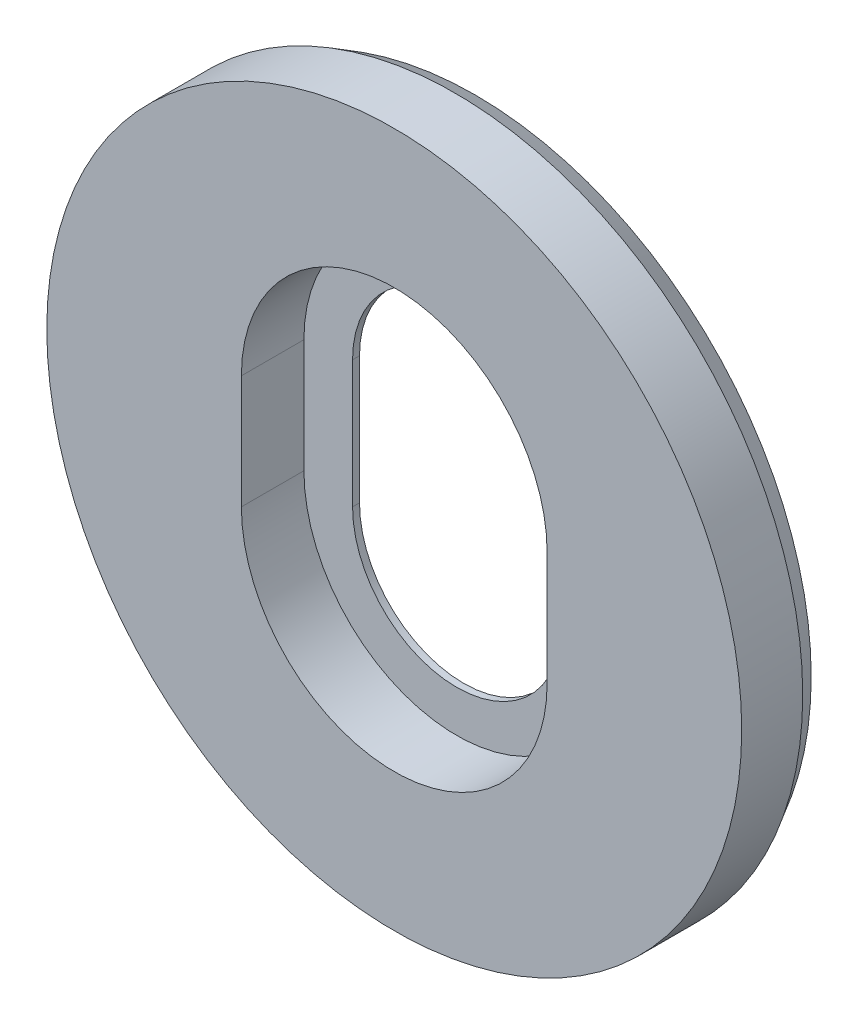
ISO-10303-21;
HEADER;
FILE_DESCRIPTION(('STEP AP214'),'2;1');
FILE_NAME('part.step','',(''),(''),'','','');
FILE_SCHEMA(('AUTOMOTIVE_DESIGN { 1 0 10303 214 1 1 1 1 }'));
ENDSEC;
DATA;
#1=APPLICATION_CONTEXT('core data for automotive mechanical design processes');
#2=APPLICATION_PROTOCOL_DEFINITION('international standard','automotive_design',2000,#1);
#3=PRODUCT_CONTEXT('',#1,'mechanical');
#4=PRODUCT('Part','Part','',(#3));
#5=PRODUCT_RELATED_PRODUCT_CATEGORY('part','',(#4));
#6=PRODUCT_DEFINITION_FORMATION('','',#4);
#7=PRODUCT_DEFINITION_CONTEXT('part definition',#1,'design');
#8=PRODUCT_DEFINITION('design','',#6,#7);
#9=PRODUCT_DEFINITION_SHAPE('','',#8);
#10=(LENGTH_UNIT() NAMED_UNIT(*) SI_UNIT(.MILLI.,.METRE.));
#11=(NAMED_UNIT(*) PLANE_ANGLE_UNIT() SI_UNIT($,.RADIAN.));
#12=(NAMED_UNIT(*) SI_UNIT($,.STERADIAN.) SOLID_ANGLE_UNIT());
#13=UNCERTAINTY_MEASURE_WITH_UNIT(LENGTH_MEASURE(1.E-05),#10,'distance_accuracy_value','');
#14=(GEOMETRIC_REPRESENTATION_CONTEXT(3) GLOBAL_UNCERTAINTY_ASSIGNED_CONTEXT((#13)) GLOBAL_UNIT_ASSIGNED_CONTEXT((#10,
#11,#12)) REPRESENTATION_CONTEXT('',''));
#15=CARTESIAN_POINT('',(0.,0.,0.));
#16=DIRECTION('',(0.,0.,1.));
#17=DIRECTION('',(1.,0.,0.));
#18=AXIS2_PLACEMENT_3D('',#15,#16,#17);
#19=CARTESIAN_POINT('',(0.,2.75,3.5));
#20=DIRECTION('',(0.,0.,-1.));
#21=DIRECTION('',(-1.,0.,0.));
#22=AXIS2_PLACEMENT_3D('',#19,#20,#21);
#23=CYLINDRICAL_SURFACE('',#22,4.5);
#24=DIRECTION('',(0.,0.,-1.));
#25=VECTOR('',#24,1.);
#26=CARTESIAN_POINT('',(-4.5,2.75,3.5));
#27=LINE('',#26,#25);
#28=CARTESIAN_POINT('',(-4.5,2.75,0.8));
#29=VERTEX_POINT('',#28);
#30=CARTESIAN_POINT('',(-4.5,2.75,0.499999999999994));
#31=VERTEX_POINT('',#30);
#32=EDGE_CURVE('E175',#29,#31,#27,.T.);
#33=ORIENTED_EDGE('',*,*,#32,.T.);
#34=CARTESIAN_POINT('',(0.,2.75,0.499999999999994));
#35=DIRECTION('',(0.,0.,1.));
#36=DIRECTION('',(1.,0.,0.));
#37=AXIS2_PLACEMENT_3D('',#34,#35,#36);
#38=CIRCLE('',#37,4.5);
#39=CARTESIAN_POINT('',(4.5,2.75,0.499999999999994));
#40=VERTEX_POINT('',#39);
#41=EDGE_CURVE('E48',#31,#40,#38,.F.);
#42=ORIENTED_EDGE('',*,*,#41,.T.);
#43=DIRECTION('',(0.,0.,-1.));
#44=VECTOR('',#43,1.);
#45=CARTESIAN_POINT('',(4.5,2.75,3.5));
#46=LINE('',#45,#44);
#47=CARTESIAN_POINT('',(4.5,2.75,0.8));
#48=VERTEX_POINT('',#47);
#49=EDGE_CURVE('E168',#48,#40,#46,.T.);
#50=ORIENTED_EDGE('',*,*,#49,.F.);
#51=CARTESIAN_POINT('',(0.,2.75,0.8));
#52=DIRECTION('',(0.,0.,1.));
#53=DIRECTION('',(1.,0.,0.));
#54=AXIS2_PLACEMENT_3D('',#51,#52,#53);
#55=CIRCLE('',#54,4.5);
#56=EDGE_CURVE('E165',#48,#29,#55,.T.);
#57=ORIENTED_EDGE('',*,*,#56,.T.);
#58=EDGE_LOOP('',(#33,#42,#50,#57));
#59=FACE_BOUND('',#58,.T.);
#60=ADVANCED_FACE('F39',(#59),#23,.F.);
#61=CARTESIAN_POINT('',(-4.5,2.75,3.5));
#62=DIRECTION('',(1.,0.,0.));
#63=DIRECTION('',(0.,1.,0.));
#64=AXIS2_PLACEMENT_3D('',#61,#62,#63);
#65=PLANE('',#64);
#66=DIRECTION('',(0.,0.,-1.));
#67=VECTOR('',#66,1.);
#68=CARTESIAN_POINT('',(-4.5,-2.75,3.5));
#69=LINE('',#68,#67);
#70=CARTESIAN_POINT('',(-4.5,-2.75,0.8));
#71=VERTEX_POINT('',#70);
#72=CARTESIAN_POINT('',(-4.5,-2.75,0.499999999999994));
#73=VERTEX_POINT('',#72);
#74=EDGE_CURVE('E173',#71,#73,#69,.T.);
#75=ORIENTED_EDGE('',*,*,#74,.T.);
#76=DIRECTION('',(0.,1.,0.));
#77=VECTOR('',#76,1.);
#78=CARTESIAN_POINT('',(-4.5,2.75,0.499999999999994));
#79=LINE('',#78,#77);
#80=EDGE_CURVE('E56',#73,#31,#79,.T.);
#81=ORIENTED_EDGE('',*,*,#80,.T.);
#82=ORIENTED_EDGE('',*,*,#32,.F.);
#83=DIRECTION('',(0.,-1.,0.));
#84=VECTOR('',#83,1.);
#85=CARTESIAN_POINT('',(-4.5,2.75,0.8));
#86=LINE('',#85,#84);
#87=EDGE_CURVE('E162',#29,#71,#86,.T.);
#88=ORIENTED_EDGE('',*,*,#87,.T.);
#89=EDGE_LOOP('',(#75,#81,#82,#88));
#90=FACE_BOUND('',#89,.T.);
#91=ADVANCED_FACE('F241',(#90),#65,.T.);
#92=CARTESIAN_POINT('',(0.,-2.75,3.5));
#93=DIRECTION('',(0.,0.,-1.));
#94=DIRECTION('',(-1.,0.,0.));
#95=AXIS2_PLACEMENT_3D('',#92,#93,#94);
#96=CYLINDRICAL_SURFACE('',#95,4.5);
#97=DIRECTION('',(0.,0.,-1.));
#98=VECTOR('',#97,1.);
#99=CARTESIAN_POINT('',(4.5,-2.75,3.5));
#100=LINE('',#99,#98);
#101=CARTESIAN_POINT('',(4.5,-2.75,0.8));
#102=VERTEX_POINT('',#101);
#103=CARTESIAN_POINT('',(4.5,-2.75,0.499999999999994));
#104=VERTEX_POINT('',#103);
#105=EDGE_CURVE('E171',#102,#104,#100,.T.);
#106=ORIENTED_EDGE('',*,*,#105,.T.);
#107=CARTESIAN_POINT('',(0.,-2.75,0.499999999999994));
#108=DIRECTION('',(0.,0.,1.));
#109=DIRECTION('',(1.,0.,0.));
#110=AXIS2_PLACEMENT_3D('',#107,#108,#109);
#111=CIRCLE('',#110,4.5);
#112=EDGE_CURVE('E64',#104,#73,#111,.F.);
#113=ORIENTED_EDGE('',*,*,#112,.T.);
#114=ORIENTED_EDGE('',*,*,#74,.F.);
#115=CARTESIAN_POINT('',(0.,-2.75,0.8));
#116=DIRECTION('',(0.,0.,1.));
#117=DIRECTION('',(1.,0.,0.));
#118=AXIS2_PLACEMENT_3D('',#115,#116,#117);
#119=CIRCLE('',#118,4.5);
#120=EDGE_CURVE('E158',#71,#102,#119,.T.);
#121=ORIENTED_EDGE('',*,*,#120,.T.);
#122=EDGE_LOOP('',(#106,#113,#114,#121));
#123=FACE_BOUND('',#122,.T.);
#124=ADVANCED_FACE('F247',(#123),#96,.F.);
#125=CARTESIAN_POINT('',(4.5,2.75,3.5));
#126=DIRECTION('',(-1.,0.,0.));
#127=DIRECTION('',(0.,-1.,0.));
#128=AXIS2_PLACEMENT_3D('',#125,#126,#127);
#129=PLANE('',#128);
#130=ORIENTED_EDGE('',*,*,#49,.T.);
#131=DIRECTION('',(0.,-1.,0.));
#132=VECTOR('',#131,1.);
#133=CARTESIAN_POINT('',(4.5,-2.75,0.499999999999994));
#134=LINE('',#133,#132);
#135=EDGE_CURVE('E195',#40,#104,#134,.T.);
#136=ORIENTED_EDGE('',*,*,#135,.T.);
#137=ORIENTED_EDGE('',*,*,#105,.F.);
#138=DIRECTION('',(0.,1.,0.));
#139=VECTOR('',#138,1.);
#140=CARTESIAN_POINT('',(4.5,2.75,0.8));
#141=LINE('',#140,#139);
#142=EDGE_CURVE('E180',#102,#48,#141,.T.);
#143=ORIENTED_EDGE('',*,*,#142,.T.);
#144=EDGE_LOOP('',(#130,#136,#137,#143));
#145=FACE_BOUND('',#144,.T.);
#146=ADVANCED_FACE('F253',(#145),#129,.T.);
#147=CARTESIAN_POINT('',(0.,0.,3.5));
#148=DIRECTION('',(0.,0.,1.));
#149=DIRECTION('',(1.,0.,0.));
#150=AXIS2_PLACEMENT_3D('',#147,#148,#149);
#151=PLANE('',#150);
#152=CARTESIAN_POINT('',(0.,2.45,3.5));
#153=DIRECTION('',(0.,0.,1.));
#154=DIRECTION('',(1.,0.,0.));
#155=AXIS2_PLACEMENT_3D('',#152,#153,#154);
#156=CIRCLE('',#155,6.6);
#157=CARTESIAN_POINT('',(6.6,2.45000000000001,3.5));
#158=VERTEX_POINT('',#157);
#159=CARTESIAN_POINT('',(-6.6,2.45000000000001,3.5));
#160=VERTEX_POINT('',#159);
#161=EDGE_CURVE('E142',#158,#160,#156,.T.);
#162=ORIENTED_EDGE('',*,*,#161,.F.);
#163=DIRECTION('',(0.,1.,0.));
#164=VECTOR('',#163,1.);
#165=CARTESIAN_POINT('',(6.6,2.45000000000001,3.5));
#166=LINE('',#165,#164);
#167=CARTESIAN_POINT('',(6.6,-2.45000000000001,3.5));
#168=VERTEX_POINT('',#167);
#169=EDGE_CURVE('E147',#168,#158,#166,.T.);
#170=ORIENTED_EDGE('',*,*,#169,.F.);
#171=CARTESIAN_POINT('',(0.,-2.45,3.5));
#172=DIRECTION('',(0.,0.,1.));
#173=DIRECTION('',(1.,0.,0.));
#174=AXIS2_PLACEMENT_3D('',#171,#172,#173);
#175=CIRCLE('',#174,6.6);
#176=CARTESIAN_POINT('',(-6.60000000000001,-2.45000000000001,3.5));
#177=VERTEX_POINT('',#176);
#178=EDGE_CURVE('E126',#177,#168,#175,.T.);
#179=ORIENTED_EDGE('',*,*,#178,.F.);
#180=DIRECTION('',(0.,-1.,0.));
#181=VECTOR('',#180,1.);
#182=CARTESIAN_POINT('',(-6.6,2.45000000000001,3.5));
#183=LINE('',#182,#181);
#184=EDGE_CURVE('E137',#160,#177,#183,.T.);
#185=ORIENTED_EDGE('',*,*,#184,.F.);
#186=EDGE_LOOP('',(#162,#170,#179,#185));
#187=FACE_BOUND('',#186,.T.);
#188=CARTESIAN_POINT('',(0.,0.,3.5));
#189=DIRECTION('',(0.,0.,1.));
#190=DIRECTION('',(1.,0.,0.));
#191=AXIS2_PLACEMENT_3D('',#188,#189,#190);
#192=CIRCLE('',#191,15.);
#193=CARTESIAN_POINT('',(15.,0.,3.5));
#194=VERTEX_POINT('',#193);
#195=EDGE_CURVE('E177',#194,#194,#192,.T.);
#196=ORIENTED_EDGE('',*,*,#195,.T.);
#197=EDGE_LOOP('',(#196));
#198=FACE_BOUND('',#197,.T.);
#199=ADVANCED_FACE('F144',(#187,#198),#151,.T.);
#200=CARTESIAN_POINT('',(0.,0.,0.));
#201=DIRECTION('',(0.,0.,1.));
#202=DIRECTION('',(1.,0.,0.));
#203=AXIS2_PLACEMENT_3D('',#200,#201,#202);
#204=PLANE('',#203);
#205=CARTESIAN_POINT('',(0.,-2.75,0.));
#206=DIRECTION('',(0.,0.,1.));
#207=DIRECTION('',(1.,0.,0.));
#208=AXIS2_PLACEMENT_3D('',#205,#206,#207);
#209=CIRCLE('',#208,5.36602540378442);
#210=CARTESIAN_POINT('',(-5.36602540378442,-2.75,0.));
#211=VERTEX_POINT('',#210);
#212=CARTESIAN_POINT('',(5.36602540378442,-2.75,0.));
#213=VERTEX_POINT('',#212);
#214=EDGE_CURVE('E190',#211,#213,#209,.T.);
#215=ORIENTED_EDGE('',*,*,#214,.T.);
#216=DIRECTION('',(0.,1.,0.));
#217=VECTOR('',#216,1.);
#218=CARTESIAN_POINT('',(5.36602540378442,2.75,0.));
#219=LINE('',#218,#217);
#220=CARTESIAN_POINT('',(5.36602540378442,2.75,0.));
#221=VERTEX_POINT('',#220);
#222=EDGE_CURVE('E192',#213,#221,#219,.T.);
#223=ORIENTED_EDGE('',*,*,#222,.T.);
#224=CARTESIAN_POINT('',(0.,2.75,0.));
#225=DIRECTION('',(0.,0.,1.));
#226=DIRECTION('',(1.,0.,0.));
#227=AXIS2_PLACEMENT_3D('',#224,#225,#226);
#228=CIRCLE('',#227,5.36602540378442);
#229=CARTESIAN_POINT('',(-5.36602540378442,2.75,0.));
#230=VERTEX_POINT('',#229);
#231=EDGE_CURVE('E186',#221,#230,#228,.T.);
#232=ORIENTED_EDGE('',*,*,#231,.T.);
#233=DIRECTION('',(0.,-1.,0.));
#234=VECTOR('',#233,1.);
#235=CARTESIAN_POINT('',(-5.36602540378442,-2.75,0.));
#236=LINE('',#235,#234);
#237=EDGE_CURVE('E188',#230,#211,#236,.T.);
#238=ORIENTED_EDGE('',*,*,#237,.T.);
#239=EDGE_LOOP('',(#215,#223,#232,#238));
#240=FACE_BOUND('',#239,.T.);
#241=CARTESIAN_POINT('',(0.,0.,0.));
#242=DIRECTION('',(0.,0.,1.));
#243=DIRECTION('',(1.,0.,0.));
#244=AXIS2_PLACEMENT_3D('',#241,#242,#243);
#245=CIRCLE('',#244,14.5);
#246=CARTESIAN_POINT('',(14.5,0.,0.));
#247=VERTEX_POINT('',#246);
#248=EDGE_CURVE('E183',#247,#247,#245,.F.);
#249=ORIENTED_EDGE('',*,*,#248,.T.);
#250=EDGE_LOOP('',(#249));
#251=FACE_BOUND('',#250,.T.);
#252=ADVANCED_FACE('F235',(#240,#251),#204,.F.);
#253=CARTESIAN_POINT('',(0.,0.,3.5));
#254=DIRECTION('',(0.,0.,-1.));
#255=DIRECTION('',(-1.,0.,0.));
#256=AXIS2_PLACEMENT_3D('',#253,#254,#255);
#257=CYLINDRICAL_SURFACE('',#256,15.);
#258=CARTESIAN_POINT('',(0.,0.,0.866025403784436));
#259=DIRECTION('',(0.,0.,1.));
#260=DIRECTION('',(1.,0.,0.));
#261=AXIS2_PLACEMENT_3D('',#258,#259,#260);
#262=CIRCLE('',#261,15.);
#263=CARTESIAN_POINT('',(15.,0.,0.866025403784436));
#264=VERTEX_POINT('',#263);
#265=EDGE_CURVE('E12',#264,#264,#262,.T.);
#266=ORIENTED_EDGE('',*,*,#265,.T.);
#267=EDGE_LOOP('',(#266));
#268=FACE_BOUND('',#267,.T.);
#269=ORIENTED_EDGE('',*,*,#195,.F.);
#270=EDGE_LOOP('',(#269));
#271=FACE_BOUND('',#270,.T.);
#272=ADVANCED_FACE('F228',(#268,#271),#257,.T.);
#273=CARTESIAN_POINT('',(0.,2.45,-22.4020088384948));
#274=DIRECTION('',(0.,0.,1.));
#275=DIRECTION('',(1.,0.,0.));
#276=AXIS2_PLACEMENT_3D('',#273,#274,#275);
#277=CYLINDRICAL_SURFACE('',#276,6.6);
#278=CARTESIAN_POINT('',(0.,2.45,0.799999999999999));
#279=DIRECTION('',(0.,0.,1.));
#280=DIRECTION('',(1.,0.,0.));
#281=AXIS2_PLACEMENT_3D('',#278,#279,#280);
#282=CIRCLE('',#281,6.6);
#283=CARTESIAN_POINT('',(-6.6,2.45000000000001,0.799999999999999));
#284=VERTEX_POINT('',#283);
#285=CARTESIAN_POINT('',(6.6,2.45000000000001,0.799999999999999));
#286=VERTEX_POINT('',#285);
#287=EDGE_CURVE('E159',#284,#286,#282,.F.);
#288=ORIENTED_EDGE('',*,*,#287,.T.);
#289=DIRECTION('',(0.,0.,1.));
#290=VECTOR('',#289,1.);
#291=CARTESIAN_POINT('',(6.6,2.45000000000001,-22.4020088384948));
#292=LINE('',#291,#290);
#293=EDGE_CURVE('E152',#286,#158,#292,.T.);
#294=ORIENTED_EDGE('',*,*,#293,.T.);
#295=ORIENTED_EDGE('',*,*,#161,.T.);
#296=DIRECTION('',(0.,0.,1.));
#297=VECTOR('',#296,1.);
#298=CARTESIAN_POINT('',(-6.6,2.45000000000001,-22.4020088384948));
#299=LINE('',#298,#297);
#300=EDGE_CURVE('E133',#284,#160,#299,.T.);
#301=ORIENTED_EDGE('',*,*,#300,.F.);
#302=EDGE_LOOP('',(#288,#294,#295,#301));
#303=FACE_BOUND('',#302,.T.);
#304=ADVANCED_FACE('F226',(#303),#277,.F.);
#305=CARTESIAN_POINT('',(6.6,2.45000000000001,-22.4020088384948));
#306=DIRECTION('',(1.,0.,0.));
#307=DIRECTION('',(0.,1.,0.));
#308=AXIS2_PLACEMENT_3D('',#305,#306,#307);
#309=PLANE('',#308);
#310=DIRECTION('',(0.,-1.,0.));
#311=VECTOR('',#310,1.);
#312=CARTESIAN_POINT('',(6.6,2.45000000000001,0.799999999999999));
#313=LINE('',#312,#311);
#314=CARTESIAN_POINT('',(6.59999999999998,-2.45,0.799999999999999));
#315=VERTEX_POINT('',#314);
#316=EDGE_CURVE('E217',#286,#315,#313,.T.);
#317=ORIENTED_EDGE('',*,*,#316,.T.);
#318=DIRECTION('',(0.,0.,1.));
#319=VECTOR('',#318,1.);
#320=CARTESIAN_POINT('',(6.6,-2.45000000000001,-22.4020088384948));
#321=LINE('',#320,#319);
#322=EDGE_CURVE('E132',#315,#168,#321,.T.);
#323=ORIENTED_EDGE('',*,*,#322,.T.);
#324=ORIENTED_EDGE('',*,*,#169,.T.);
#325=ORIENTED_EDGE('',*,*,#293,.F.);
#326=EDGE_LOOP('',(#317,#323,#324,#325));
#327=FACE_BOUND('',#326,.T.);
#328=ADVANCED_FACE('F222',(#327),#309,.F.);
#329=CARTESIAN_POINT('',(0.,-2.45,-22.4020088384948));
#330=DIRECTION('',(0.,0.,1.));
#331=DIRECTION('',(1.,0.,0.));
#332=AXIS2_PLACEMENT_3D('',#329,#330,#331);
#333=CYLINDRICAL_SURFACE('',#332,6.6);
#334=CARTESIAN_POINT('',(0.,-2.45,0.799999999999999));
#335=DIRECTION('',(0.,0.,1.));
#336=DIRECTION('',(1.,0.,0.));
#337=AXIS2_PLACEMENT_3D('',#334,#335,#336);
#338=CIRCLE('',#337,6.6);
#339=CARTESIAN_POINT('',(-6.60000000000001,-2.45000000000001,0.799999999999999));
#340=VERTEX_POINT('',#339);
#341=EDGE_CURVE('E129',#315,#340,#338,.F.);
#342=ORIENTED_EDGE('',*,*,#341,.T.);
#343=DIRECTION('',(0.,0.,1.));
#344=VECTOR('',#343,1.);
#345=CARTESIAN_POINT('',(-6.60000000000001,-2.45000000000001,-22.4020088384948));
#346=LINE('',#345,#344);
#347=EDGE_CURVE('E121',#340,#177,#346,.T.);
#348=ORIENTED_EDGE('',*,*,#347,.T.);
#349=ORIENTED_EDGE('',*,*,#178,.T.);
#350=ORIENTED_EDGE('',*,*,#322,.F.);
#351=EDGE_LOOP('',(#342,#348,#349,#350));
#352=FACE_BOUND('',#351,.T.);
#353=ADVANCED_FACE('F123',(#352),#333,.F.);
#354=CARTESIAN_POINT('',(-6.6,2.45000000000001,-22.4020088384948));
#355=DIRECTION('',(-1.,0.,0.));
#356=DIRECTION('',(0.,0.,1.));
#357=AXIS2_PLACEMENT_3D('',#354,#355,#356);
#358=PLANE('',#357);
#359=DIRECTION('',(0.,1.,0.));
#360=VECTOR('',#359,1.);
#361=CARTESIAN_POINT('',(-6.6,2.45000000000001,0.799999999999999));
#362=LINE('',#361,#360);
#363=EDGE_CURVE('E156',#340,#284,#362,.T.);
#364=ORIENTED_EDGE('',*,*,#363,.T.);
#365=ORIENTED_EDGE('',*,*,#300,.T.);
#366=ORIENTED_EDGE('',*,*,#184,.T.);
#367=ORIENTED_EDGE('',*,*,#347,.F.);
#368=EDGE_LOOP('',(#364,#365,#366,#367));
#369=FACE_BOUND('',#368,.T.);
#370=ADVANCED_FACE('F138',(#369),#358,.F.);
#371=CARTESIAN_POINT('',(0.,0.,0.8));
#372=DIRECTION('',(0.,0.,1.));
#373=DIRECTION('',(1.,0.,0.));
#374=AXIS2_PLACEMENT_3D('',#371,#372,#373);
#375=PLANE('',#374);
#376=ORIENTED_EDGE('',*,*,#142,.F.);
#377=ORIENTED_EDGE('',*,*,#120,.F.);
#378=ORIENTED_EDGE('',*,*,#87,.F.);
#379=ORIENTED_EDGE('',*,*,#56,.F.);
#380=EDGE_LOOP('',(#376,#377,#378,#379));
#381=FACE_BOUND('',#380,.T.);
#382=ORIENTED_EDGE('',*,*,#287,.F.);
#383=ORIENTED_EDGE('',*,*,#363,.F.);
#384=ORIENTED_EDGE('',*,*,#341,.F.);
#385=ORIENTED_EDGE('',*,*,#316,.F.);
#386=EDGE_LOOP('',(#382,#383,#384,#385));
#387=FACE_BOUND('',#386,.T.);
#388=ADVANCED_FACE('F225',(#381,#387),#375,.T.);
#389=CARTESIAN_POINT('',(-5.36602540378442,0.,0.));
#390=DIRECTION('',(0.500000000000003,0.,-0.866025403784437));
#391=DIRECTION('',(0.,1.,0.));
#392=AXIS2_PLACEMENT_3D('',#389,#390,#391);
#393=PLANE('',#392);
#394=DIRECTION('',(-0.866025403784437,0.,-0.500000000000003));
#395=VECTOR('',#394,1.);
#396=CARTESIAN_POINT('',(-4.5,2.75,0.499999999999994));
#397=LINE('',#396,#395);
#398=EDGE_CURVE('E204',#31,#230,#397,.T.);
#399=ORIENTED_EDGE('',*,*,#398,.F.);
#400=ORIENTED_EDGE('',*,*,#80,.F.);
#401=DIRECTION('',(0.866025403784437,0.,0.500000000000003));
#402=VECTOR('',#401,1.);
#403=CARTESIAN_POINT('',(-5.36602540378442,-2.75,0.));
#404=LINE('',#403,#402);
#405=EDGE_CURVE('E43',#211,#73,#404,.T.);
#406=ORIENTED_EDGE('',*,*,#405,.F.);
#407=ORIENTED_EDGE('',*,*,#237,.F.);
#408=EDGE_LOOP('',(#399,#400,#406,#407));
#409=FACE_BOUND('',#408,.T.);
#410=ADVANCED_FACE('F266',(#409),#393,.T.);
#411=CARTESIAN_POINT('',(0.,-2.75,0.));
#412=DIRECTION('',(0.,0.,-1.));
#413=DIRECTION('',(-1.,0.,0.));
#414=AXIS2_PLACEMENT_3D('',#411,#412,#413);
#415=CONICAL_SURFACE('',#414,5.36602540378442,1.04719755119659);
#416=ORIENTED_EDGE('',*,*,#405,.T.);
#417=ORIENTED_EDGE('',*,*,#112,.F.);
#418=DIRECTION('',(-0.866025403784437,0.,0.500000000000003));
#419=VECTOR('',#418,1.);
#420=CARTESIAN_POINT('',(5.36602540378442,-2.75,0.));
#421=LINE('',#420,#419);
#422=EDGE_CURVE('E203',#213,#104,#421,.T.);
#423=ORIENTED_EDGE('',*,*,#422,.F.);
#424=ORIENTED_EDGE('',*,*,#214,.F.);
#425=EDGE_LOOP('',(#416,#417,#423,#424));
#426=FACE_BOUND('',#425,.T.);
#427=ADVANCED_FACE('F264',(#426),#415,.F.);
#428=CARTESIAN_POINT('',(0.,2.75,0.));
#429=DIRECTION('',(0.,0.,-1.));
#430=DIRECTION('',(-1.,0.,0.));
#431=AXIS2_PLACEMENT_3D('',#428,#429,#430);
#432=CONICAL_SURFACE('',#431,5.36602540378442,1.04719755119659);
#433=ORIENTED_EDGE('',*,*,#398,.T.);
#434=ORIENTED_EDGE('',*,*,#231,.F.);
#435=DIRECTION('',(0.866025403784437,0.,-0.500000000000003));
#436=VECTOR('',#435,1.);
#437=CARTESIAN_POINT('',(4.5,2.75,0.499999999999994));
#438=LINE('',#437,#436);
#439=EDGE_CURVE('E201',#40,#221,#438,.T.);
#440=ORIENTED_EDGE('',*,*,#439,.F.);
#441=ORIENTED_EDGE('',*,*,#41,.F.);
#442=EDGE_LOOP('',(#433,#434,#440,#441));
#443=FACE_BOUND('',#442,.T.);
#444=ADVANCED_FACE('F260',(#443),#432,.F.);
#445=CARTESIAN_POINT('',(5.36602540378442,0.,0.));
#446=DIRECTION('',(-0.500000000000003,0.,-0.866025403784437));
#447=DIRECTION('',(0.,-1.,0.));
#448=AXIS2_PLACEMENT_3D('',#445,#446,#447);
#449=PLANE('',#448);
#450=ORIENTED_EDGE('',*,*,#422,.T.);
#451=ORIENTED_EDGE('',*,*,#135,.F.);
#452=ORIENTED_EDGE('',*,*,#439,.T.);
#453=ORIENTED_EDGE('',*,*,#222,.F.);
#454=EDGE_LOOP('',(#450,#451,#452,#453));
#455=FACE_BOUND('',#454,.T.);
#456=ADVANCED_FACE('F257',(#455),#449,.T.);
#457=CARTESIAN_POINT('',(0.,0.,0.866025403784436));
#458=DIRECTION('',(0.,0.,1.));
#459=DIRECTION('',(1.,0.,0.));
#460=AXIS2_PLACEMENT_3D('',#457,#458,#459);
#461=CONICAL_SURFACE('',#460,15.,0.523598775598301);
#462=ORIENTED_EDGE('',*,*,#248,.F.);
#463=EDGE_LOOP('',(#462));
#464=FACE_BOUND('',#463,.T.);
#465=ORIENTED_EDGE('',*,*,#265,.F.);
#466=EDGE_LOOP('',(#465));
#467=FACE_BOUND('',#466,.T.);
#468=ADVANCED_FACE('F41',(#464,#467),#461,.T.);
#469=CLOSED_SHELL('',(#60,#91,#124,#146,#199,#252,#272,#304,#328,#353,#370,#388,#410,#427,#444,
#456,#468));
#470=MANIFOLD_SOLID_BREP('B2',#469);
#471=ADVANCED_BREP_SHAPE_REPRESENTATION('',(#18,#470),#14);
#472=SHAPE_DEFINITION_REPRESENTATION(#9,#471);
ENDSEC;
END-ISO-10303-21;
